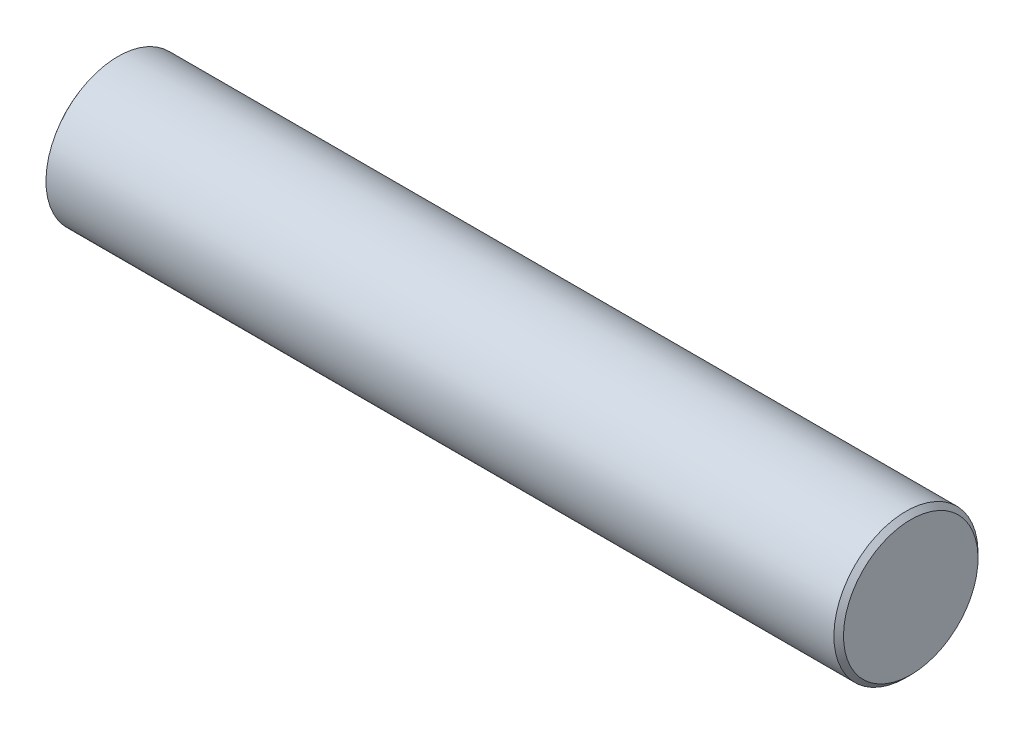
ISO-10303-21;
HEADER;
FILE_DESCRIPTION(('STEP AP214'),'2;1');
FILE_NAME('part.step','',(''),(''),'','','');
FILE_SCHEMA(('AUTOMOTIVE_DESIGN { 1 0 10303 214 1 1 1 1 }'));
ENDSEC;
DATA;
#1=APPLICATION_CONTEXT('core data for automotive mechanical design processes');
#2=APPLICATION_PROTOCOL_DEFINITION('international standard','automotive_design',2000,#1);
#3=PRODUCT_CONTEXT('',#1,'mechanical');
#4=PRODUCT('Part','Part','',(#3));
#5=PRODUCT_RELATED_PRODUCT_CATEGORY('part','',(#4));
#6=PRODUCT_DEFINITION_FORMATION('','',#4);
#7=PRODUCT_DEFINITION_CONTEXT('part definition',#1,'design');
#8=PRODUCT_DEFINITION('design','',#6,#7);
#9=PRODUCT_DEFINITION_SHAPE('','',#8);
#10=(LENGTH_UNIT() NAMED_UNIT(*) SI_UNIT(.MILLI.,.METRE.));
#11=(NAMED_UNIT(*) PLANE_ANGLE_UNIT() SI_UNIT($,.RADIAN.));
#12=(NAMED_UNIT(*) SI_UNIT($,.STERADIAN.) SOLID_ANGLE_UNIT());
#13=UNCERTAINTY_MEASURE_WITH_UNIT(LENGTH_MEASURE(1.E-05),#10,'distance_accuracy_value','');
#14=(GEOMETRIC_REPRESENTATION_CONTEXT(3) GLOBAL_UNCERTAINTY_ASSIGNED_CONTEXT((#13)) GLOBAL_UNIT_ASSIGNED_CONTEXT((#10,
#11,#12)) REPRESENTATION_CONTEXT('',''));
#15=CARTESIAN_POINT('',(0.,0.,0.));
#16=DIRECTION('',(0.,0.,1.));
#17=DIRECTION('',(1.,0.,0.));
#18=AXIS2_PLACEMENT_3D('',#15,#16,#17);
#19=CARTESIAN_POINT('',(-83.,0.,0.));
#20=DIRECTION('',(1.,0.,0.));
#21=DIRECTION('',(0.,1.,0.));
#22=AXIS2_PLACEMENT_3D('',#19,#20,#21);
#23=PLANE('',#22);
#24=CARTESIAN_POINT('',(-83.,0.,0.));
#25=DIRECTION('',(-1.,0.,0.));
#26=DIRECTION('',(0.,-1.,0.));
#27=AXIS2_PLACEMENT_3D('',#24,#25,#26);
#28=CIRCLE('',#27,13.6214495382852);
#29=CARTESIAN_POINT('',(-83.,-13.6214495382852,0.));
#30=VERTEX_POINT('',#29);
#31=EDGE_CURVE('E10',#30,#30,#28,.T.);
#32=ORIENTED_EDGE('',*,*,#31,.T.);
#33=EDGE_LOOP('',(#32));
#34=FACE_BOUND('',#33,.T.);
#35=ADVANCED_FACE('F32',(#34),#23,.F.);
#36=CARTESIAN_POINT('',(-82.,0.,0.));
#37=DIRECTION('',(1.,0.,0.));
#38=DIRECTION('',(0.,1.,0.));
#39=AXIS2_PLACEMENT_3D('',#36,#37,#38);
#40=CONICAL_SURFACE('',#39,15.,0.943226236716249);
#41=ORIENTED_EDGE('',*,*,#31,.F.);
#42=EDGE_LOOP('',(#41));
#43=FACE_BOUND('',#42,.T.);
#44=CARTESIAN_POINT('',(-82.,0.,0.));
#45=DIRECTION('',(-1.,0.,0.));
#46=DIRECTION('',(0.,-1.,0.));
#47=AXIS2_PLACEMENT_3D('',#44,#45,#46);
#48=CIRCLE('',#47,15.);
#49=CARTESIAN_POINT('',(-82.,-15.,0.));
#50=VERTEX_POINT('',#49);
#51=EDGE_CURVE('E38',#50,#50,#48,.T.);
#52=ORIENTED_EDGE('',*,*,#51,.T.);
#53=EDGE_LOOP('',(#52));
#54=FACE_BOUND('',#53,.T.);
#55=ADVANCED_FACE('F64',(#43,#54),#40,.T.);
#56=CARTESIAN_POINT('',(-83.,0.,0.));
#57=DIRECTION('',(-1.,0.,0.));
#58=DIRECTION('',(0.,-1.,0.));
#59=AXIS2_PLACEMENT_3D('',#56,#57,#58);
#60=CYLINDRICAL_SURFACE('',#59,15.);
#61=ORIENTED_EDGE('',*,*,#51,.F.);
#62=EDGE_LOOP('',(#61));
#63=FACE_BOUND('',#62,.T.);
#64=CARTESIAN_POINT('',(82.,0.,0.));
#65=DIRECTION('',(-1.,0.,0.));
#66=DIRECTION('',(0.,-1.,0.));
#67=AXIS2_PLACEMENT_3D('',#64,#65,#66);
#68=CIRCLE('',#67,15.);
#69=CARTESIAN_POINT('',(82.,-15.,0.));
#70=VERTEX_POINT('',#69);
#71=EDGE_CURVE('E42',#70,#70,#68,.T.);
#72=ORIENTED_EDGE('',*,*,#71,.T.);
#73=EDGE_LOOP('',(#72));
#74=FACE_BOUND('',#73,.T.);
#75=ADVANCED_FACE('F60',(#63,#74),#60,.T.);
#76=CARTESIAN_POINT('',(83.,0.,0.));
#77=DIRECTION('',(-1.,0.,0.));
#78=DIRECTION('',(0.,-1.,0.));
#79=AXIS2_PLACEMENT_3D('',#76,#77,#78);
#80=CONICAL_SURFACE('',#79,14.,0.785398163397429);
#81=ORIENTED_EDGE('',*,*,#71,.F.);
#82=EDGE_LOOP('',(#81));
#83=FACE_BOUND('',#82,.T.);
#84=CARTESIAN_POINT('',(83.,0.,0.));
#85=DIRECTION('',(-1.,0.,0.));
#86=DIRECTION('',(0.,-1.,0.));
#87=AXIS2_PLACEMENT_3D('',#84,#85,#86);
#88=CIRCLE('',#87,14.);
#89=CARTESIAN_POINT('',(83.,-14.,0.));
#90=VERTEX_POINT('',#89);
#91=EDGE_CURVE('E46',#90,#90,#88,.T.);
#92=ORIENTED_EDGE('',*,*,#91,.T.);
#93=EDGE_LOOP('',(#92));
#94=FACE_BOUND('',#93,.T.);
#95=ADVANCED_FACE('F52',(#83,#94),#80,.T.);
#96=CARTESIAN_POINT('',(83.,14.,0.));
#97=DIRECTION('',(-1.,0.,0.));
#98=DIRECTION('',(0.,-1.,0.));
#99=AXIS2_PLACEMENT_3D('',#96,#97,#98);
#100=PLANE('',#99);
#101=ORIENTED_EDGE('',*,*,#91,.F.);
#102=EDGE_LOOP('',(#101));
#103=FACE_BOUND('',#102,.T.);
#104=ADVANCED_FACE('F54',(#103),#100,.F.);
#105=CLOSED_SHELL('',(#35,#55,#75,#95,#104));
#106=MANIFOLD_SOLID_BREP('B2',#105);
#107=ADVANCED_BREP_SHAPE_REPRESENTATION('',(#18,#106),#14);
#108=SHAPE_DEFINITION_REPRESENTATION(#9,#107);
ENDSEC;
END-ISO-10303-21;
